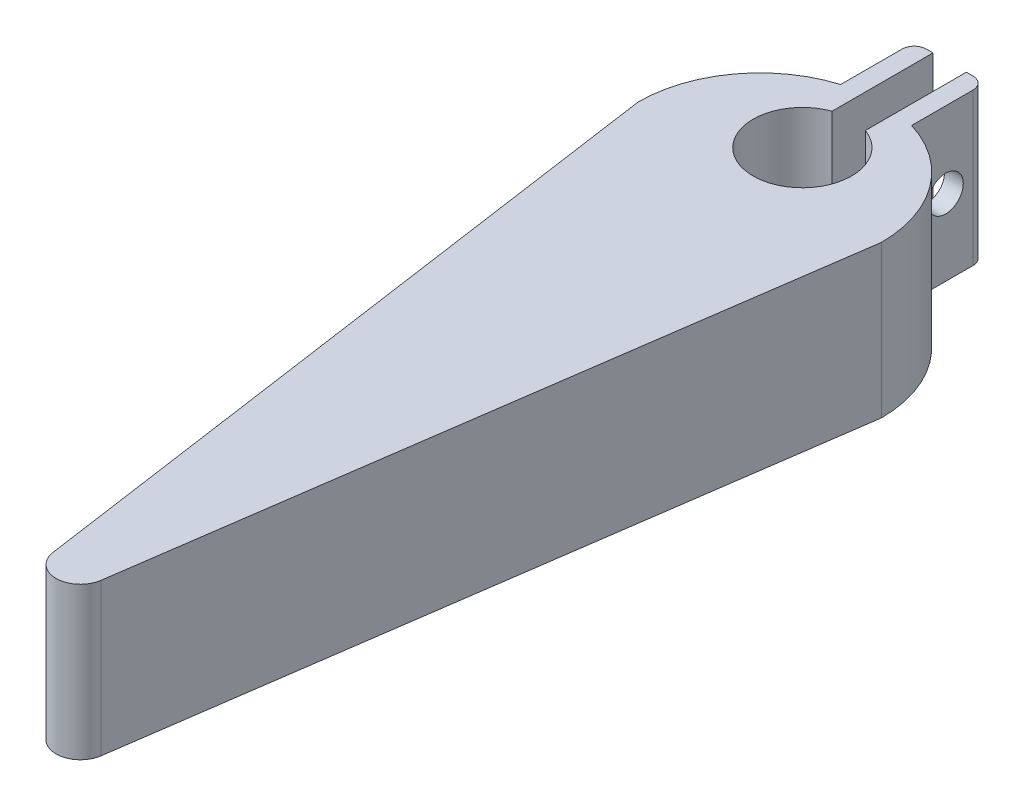
ISO-10303-21;
HEADER;
FILE_DESCRIPTION(('STEP AP214'),'2;1');
FILE_NAME('part.step','',(''),(''),'','','');
FILE_SCHEMA(('AUTOMOTIVE_DESIGN { 1 0 10303 214 1 1 1 1 }'));
ENDSEC;
DATA;
#1=APPLICATION_CONTEXT('core data for automotive mechanical design processes');
#2=APPLICATION_PROTOCOL_DEFINITION('international standard','automotive_design',2000,#1);
#3=PRODUCT_CONTEXT('',#1,'mechanical');
#4=PRODUCT('Part','Part','',(#3));
#5=PRODUCT_RELATED_PRODUCT_CATEGORY('part','',(#4));
#6=PRODUCT_DEFINITION_FORMATION('','',#4);
#7=PRODUCT_DEFINITION_CONTEXT('part definition',#1,'design');
#8=PRODUCT_DEFINITION('design','',#6,#7);
#9=PRODUCT_DEFINITION_SHAPE('','',#8);
#10=(LENGTH_UNIT() NAMED_UNIT(*) SI_UNIT(.MILLI.,.METRE.));
#11=(NAMED_UNIT(*) PLANE_ANGLE_UNIT() SI_UNIT($,.RADIAN.));
#12=(NAMED_UNIT(*) SI_UNIT($,.STERADIAN.) SOLID_ANGLE_UNIT());
#13=UNCERTAINTY_MEASURE_WITH_UNIT(LENGTH_MEASURE(1.E-05),#10,'distance_accuracy_value','');
#14=(GEOMETRIC_REPRESENTATION_CONTEXT(3) GLOBAL_UNCERTAINTY_ASSIGNED_CONTEXT((#13)) GLOBAL_UNIT_ASSIGNED_CONTEXT((#10,
#11,#12)) REPRESENTATION_CONTEXT('',''));
#15=CARTESIAN_POINT('',(0.,0.,0.));
#16=DIRECTION('',(0.,0.,1.));
#17=DIRECTION('',(1.,0.,0.));
#18=AXIS2_PLACEMENT_3D('',#15,#16,#17);
#19=CARTESIAN_POINT('',(0.,12.5,0.));
#20=DIRECTION('',(0.,-1.,0.));
#21=DIRECTION('',(0.,0.,-1.));
#22=AXIS2_PLACEMENT_3D('',#19,#20,#21);
#23=CYLINDRICAL_SURFACE('',#22,10.);
#24=CARTESIAN_POINT('',(0.,12.5,0.));
#25=DIRECTION('',(0.,1.,0.));
#26=DIRECTION('',(0.,0.,-1.));
#27=AXIS2_PLACEMENT_3D('',#24,#25,#26);
#28=CIRCLE('',#27,10.);
#29=CARTESIAN_POINT('',(-2.91788586974109,12.5,-9.56482838587109));
#30=VERTEX_POINT('',#29);
#31=CARTESIAN_POINT('',(-10.,12.5,0.));
#32=VERTEX_POINT('',#31);
#33=EDGE_CURVE('E194',#30,#32,#28,.T.);
#34=ORIENTED_EDGE('',*,*,#33,.F.);
#35=DIRECTION('',(0.,1.,0.));
#36=VECTOR('',#35,1.);
#37=CARTESIAN_POINT('',(-2.91788586974109,0.,-9.56482838587109));
#38=LINE('',#37,#36);
#39=CARTESIAN_POINT('',(-2.91788586974109,0.,-9.56482838587109));
#40=VERTEX_POINT('',#39);
#41=EDGE_CURVE('E177',#40,#30,#38,.T.);
#42=ORIENTED_EDGE('',*,*,#41,.F.);
#43=CARTESIAN_POINT('',(0.,0.,0.));
#44=DIRECTION('',(0.,1.,0.));
#45=DIRECTION('',(0.,0.,-1.));
#46=AXIS2_PLACEMENT_3D('',#43,#44,#45);
#47=CIRCLE('',#46,10.);
#48=CARTESIAN_POINT('',(-10.,0.,0.));
#49=VERTEX_POINT('',#48);
#50=EDGE_CURVE('E188',#40,#49,#47,.T.);
#51=ORIENTED_EDGE('',*,*,#50,.T.);
#52=DIRECTION('',(0.,-1.,0.));
#53=VECTOR('',#52,1.);
#54=CARTESIAN_POINT('',(-10.,12.5,0.));
#55=LINE('',#54,#53);
#56=EDGE_CURVE('E209',#32,#49,#55,.T.);
#57=ORIENTED_EDGE('',*,*,#56,.F.);
#58=EDGE_LOOP('',(#34,#42,#51,#57));
#59=FACE_BOUND('',#58,.T.);
#60=ADVANCED_FACE('F37',(#59),#23,.T.);
#61=CARTESIAN_POINT('',(0.,12.5,0.));
#62=DIRECTION('',(0.,-1.,0.));
#63=DIRECTION('',(0.,0.,-1.));
#64=AXIS2_PLACEMENT_3D('',#61,#62,#63);
#65=PLANE('',#64);
#66=DIRECTION('',(-1.,0.,0.));
#67=VECTOR('',#66,1.);
#68=CARTESIAN_POINT('',(-1.3711215575442,12.5,-15.6135914165917));
#69=LINE('',#68,#67);
#70=CARTESIAN_POINT('',(-1.3711215575442,12.5,-15.6135914165917));
#71=VERTEX_POINT('',#70);
#72=CARTESIAN_POINT('',(-1.91788586974109,12.5,-15.6135914165917));
#73=VERTEX_POINT('',#72);
#74=EDGE_CURVE('E160',#71,#73,#69,.T.);
#75=ORIENTED_EDGE('',*,*,#74,.T.);
#76=CARTESIAN_POINT('',(-1.91788586974109,12.5,-14.6135914165917));
#77=DIRECTION('',(0.,-1.,0.));
#78=DIRECTION('',(0.,0.,-1.));
#79=AXIS2_PLACEMENT_3D('',#76,#77,#78);
#80=CIRCLE('',#79,1.);
#81=CARTESIAN_POINT('',(-2.91788586974109,12.5,-14.6135914165917));
#82=VERTEX_POINT('',#81);
#83=EDGE_CURVE('E230',#73,#82,#80,.F.);
#84=ORIENTED_EDGE('',*,*,#83,.T.);
#85=DIRECTION('',(0.,0.,1.));
#86=VECTOR('',#85,1.);
#87=CARTESIAN_POINT('',(-2.91788586974109,12.5,-9.56482838587109));
#88=LINE('',#87,#86);
#89=EDGE_CURVE('E163',#82,#30,#88,.T.);
#90=ORIENTED_EDGE('',*,*,#89,.T.);
#91=ORIENTED_EDGE('',*,*,#33,.T.);
#92=DIRECTION('',(0.14142135623731,0.,0.989949493661166));
#93=VECTOR('',#92,1.);
#94=CARTESIAN_POINT('',(-10.,12.5,0.));
#95=LINE('',#94,#93);
#96=CARTESIAN_POINT('',(-1.97989898732233,12.5,56.1407070887437));
#97=VERTEX_POINT('',#96);
#98=EDGE_CURVE('E193',#32,#97,#95,.T.);
#99=ORIENTED_EDGE('',*,*,#98,.T.);
#100=CARTESIAN_POINT('',(0.,12.5,55.8578643762691));
#101=DIRECTION('',(0.,-1.,0.));
#102=DIRECTION('',(0.,0.,-1.));
#103=AXIS2_PLACEMENT_3D('',#100,#101,#102);
#104=CIRCLE('',#103,2.);
#105=CARTESIAN_POINT('',(1.97989898732234,12.5,56.1407070887437));
#106=VERTEX_POINT('',#105);
#107=EDGE_CURVE('E219',#97,#106,#104,.F.);
#108=ORIENTED_EDGE('',*,*,#107,.T.);
#109=DIRECTION('',(0.14142135623731,0.,-0.989949493661167));
#110=VECTOR('',#109,1.);
#111=CARTESIAN_POINT('',(0.,12.5,70.));
#112=LINE('',#111,#110);
#113=CARTESIAN_POINT('',(10.,12.5,0.));
#114=VERTEX_POINT('',#113);
#115=EDGE_CURVE('E197',#106,#114,#112,.T.);
#116=ORIENTED_EDGE('',*,*,#115,.T.);
#117=CARTESIAN_POINT('',(2.91707262499972,12.5,-9.56507643986588));
#118=VERTEX_POINT('',#117);
#119=EDGE_CURVE('E190',#114,#118,#28,.T.);
#120=ORIENTED_EDGE('',*,*,#119,.T.);
#121=DIRECTION('',(0.,0.,-1.));
#122=VECTOR('',#121,1.);
#123=CARTESIAN_POINT('',(2.91707262499972,12.5,-15.6135914165917));
#124=LINE('',#123,#122);
#125=CARTESIAN_POINT('',(2.91707262499972,12.5,-14.6135914165917));
#126=VERTEX_POINT('',#125);
#127=EDGE_CURVE('E243',#118,#126,#124,.T.);
#128=ORIENTED_EDGE('',*,*,#127,.T.);
#129=CARTESIAN_POINT('',(1.91707262499972,12.5,-14.6135914165917));
#130=DIRECTION('',(0.,-1.,0.));
#131=DIRECTION('',(0.,0.,-1.));
#132=AXIS2_PLACEMENT_3D('',#129,#130,#131);
#133=CIRCLE('',#132,1.);
#134=CARTESIAN_POINT('',(1.91707262499972,12.5,-15.6135914165917));
#135=VERTEX_POINT('',#134);
#136=EDGE_CURVE('E228',#126,#135,#133,.F.);
#137=ORIENTED_EDGE('',*,*,#136,.T.);
#138=DIRECTION('',(-1.,0.,0.));
#139=VECTOR('',#138,1.);
#140=CARTESIAN_POINT('',(1.37409961350026,12.5,-15.6135914165917));
#141=LINE('',#140,#139);
#142=CARTESIAN_POINT('',(1.37409961350026,12.5,-15.6135914165917));
#143=VERTEX_POINT('',#142);
#144=EDGE_CURVE('E167',#135,#143,#141,.T.);
#145=ORIENTED_EDGE('',*,*,#144,.T.);
#146=DIRECTION('',(0.,0.,-1.));
#147=VECTOR('',#146,1.);
#148=CARTESIAN_POINT('',(1.37409961350026,12.5,-3.75657427081889));
#149=LINE('',#148,#147);
#150=CARTESIAN_POINT('',(1.37409961350026,12.5,-7.30977036738154));
#151=VERTEX_POINT('',#150);
#152=EDGE_CURVE('E159',#151,#143,#149,.T.);
#153=ORIENTED_EDGE('',*,*,#152,.F.);
#154=CARTESIAN_POINT('',(0.,12.5,-3.5));
#155=DIRECTION('',(0.,1.,0.));
#156=DIRECTION('',(0.,0.,1.));
#157=AXIS2_PLACEMENT_3D('',#154,#155,#156);
#158=CIRCLE('',#157,4.05);
#159=CARTESIAN_POINT('',(-1.3711215575442,12.5,-7.31084317106301));
#160=VERTEX_POINT('',#159);
#161=EDGE_CURVE('E185',#160,#151,#158,.T.);
#162=ORIENTED_EDGE('',*,*,#161,.F.);
#163=DIRECTION('',(0.,0.,1.));
#164=VECTOR('',#163,1.);
#165=CARTESIAN_POINT('',(-1.3711215575442,12.5,-3.7576622618907));
#166=LINE('',#165,#164);
#167=EDGE_CURVE('E154',#71,#160,#166,.T.);
#168=ORIENTED_EDGE('',*,*,#167,.F.);
#169=EDGE_LOOP('',(#75,#84,#90,#91,#99,#108,#116,#120,#128,#137,#145,#153,#162,#168));
#170=FACE_BOUND('',#169,.T.);
#171=ADVANCED_FACE('F246',(#170),#65,.F.);
#172=CARTESIAN_POINT('',(0.,0.,0.));
#173=DIRECTION('',(0.,-1.,0.));
#174=DIRECTION('',(0.,0.,-1.));
#175=AXIS2_PLACEMENT_3D('',#172,#173,#174);
#176=PLANE('',#175);
#177=DIRECTION('',(0.,0.,1.));
#178=VECTOR('',#177,1.);
#179=CARTESIAN_POINT('',(-2.91788586974109,0.,-9.56482838587109));
#180=LINE('',#179,#178);
#181=CARTESIAN_POINT('',(-2.91788586974109,0.,-14.6135914165917));
#182=VERTEX_POINT('',#181);
#183=EDGE_CURVE('E173',#182,#40,#180,.T.);
#184=ORIENTED_EDGE('',*,*,#183,.F.);
#185=CARTESIAN_POINT('',(-1.91788586974109,0.,-14.6135914165917));
#186=DIRECTION('',(0.,-1.,0.));
#187=DIRECTION('',(0.,0.,-1.));
#188=AXIS2_PLACEMENT_3D('',#185,#186,#187);
#189=CIRCLE('',#188,1.);
#190=CARTESIAN_POINT('',(-1.91788586974109,0.,-15.6135914165917));
#191=VERTEX_POINT('',#190);
#192=EDGE_CURVE('E235',#182,#191,#189,.T.);
#193=ORIENTED_EDGE('',*,*,#192,.T.);
#194=DIRECTION('',(-1.,0.,0.));
#195=VECTOR('',#194,1.);
#196=CARTESIAN_POINT('',(-1.3711215575442,0.,-15.6135914165917));
#197=LINE('',#196,#195);
#198=CARTESIAN_POINT('',(-1.3711215575442,0.,-15.6135914165917));
#199=VERTEX_POINT('',#198);
#200=EDGE_CURVE('E170',#199,#191,#197,.T.);
#201=ORIENTED_EDGE('',*,*,#200,.F.);
#202=DIRECTION('',(0.,0.,1.));
#203=VECTOR('',#202,1.);
#204=CARTESIAN_POINT('',(-1.3711215575442,0.,-3.7576622618907));
#205=LINE('',#204,#203);
#206=CARTESIAN_POINT('',(-1.3711215575442,0.,-7.31084317106301));
#207=VERTEX_POINT('',#206);
#208=EDGE_CURVE('E153',#199,#207,#205,.T.);
#209=ORIENTED_EDGE('',*,*,#208,.T.);
#210=CARTESIAN_POINT('',(0.,0.,-3.5));
#211=DIRECTION('',(0.,1.,0.));
#212=DIRECTION('',(0.,0.,1.));
#213=AXIS2_PLACEMENT_3D('',#210,#211,#212);
#214=CIRCLE('',#213,4.05);
#215=CARTESIAN_POINT('',(1.37409961350026,0.,-7.30977036738154));
#216=VERTEX_POINT('',#215);
#217=EDGE_CURVE('E150',#207,#216,#214,.T.);
#218=ORIENTED_EDGE('',*,*,#217,.T.);
#219=DIRECTION('',(0.,0.,-1.));
#220=VECTOR('',#219,1.);
#221=CARTESIAN_POINT('',(1.37409961350026,0.,-3.75657427081889));
#222=LINE('',#221,#220);
#223=CARTESIAN_POINT('',(1.37409961350026,0.,-15.6135914165917));
#224=VERTEX_POINT('',#223);
#225=EDGE_CURVE('E145',#216,#224,#222,.T.);
#226=ORIENTED_EDGE('',*,*,#225,.T.);
#227=DIRECTION('',(-1.,0.,0.));
#228=VECTOR('',#227,1.);
#229=CARTESIAN_POINT('',(1.37409961350026,0.,-15.6135914165917));
#230=LINE('',#229,#228);
#231=CARTESIAN_POINT('',(1.91707262499972,0.,-15.6135914165917));
#232=VERTEX_POINT('',#231);
#233=EDGE_CURVE('E136',#232,#224,#230,.T.);
#234=ORIENTED_EDGE('',*,*,#233,.F.);
#235=CARTESIAN_POINT('',(1.91707262499972,0.,-14.6135914165917));
#236=DIRECTION('',(0.,-1.,0.));
#237=DIRECTION('',(0.,0.,-1.));
#238=AXIS2_PLACEMENT_3D('',#235,#236,#237);
#239=CIRCLE('',#238,1.);
#240=CARTESIAN_POINT('',(2.91707262499972,0.,-14.6135914165917));
#241=VERTEX_POINT('',#240);
#242=EDGE_CURVE('E52',#232,#241,#239,.T.);
#243=ORIENTED_EDGE('',*,*,#242,.T.);
#244=DIRECTION('',(0.,0.,-1.));
#245=VECTOR('',#244,1.);
#246=CARTESIAN_POINT('',(2.91707262499972,0.,-15.6135914165917));
#247=LINE('',#246,#245);
#248=CARTESIAN_POINT('',(2.91707262499972,0.,-9.56507643986588));
#249=VERTEX_POINT('',#248);
#250=EDGE_CURVE('E142',#249,#241,#247,.T.);
#251=ORIENTED_EDGE('',*,*,#250,.F.);
#252=CARTESIAN_POINT('',(10.,0.,0.));
#253=VERTEX_POINT('',#252);
#254=EDGE_CURVE('E200',#253,#249,#47,.T.);
#255=ORIENTED_EDGE('',*,*,#254,.F.);
#256=DIRECTION('',(0.14142135623731,0.,-0.989949493661167));
#257=VECTOR('',#256,1.);
#258=CARTESIAN_POINT('',(0.,0.,70.));
#259=LINE('',#258,#257);
#260=CARTESIAN_POINT('',(1.97989898732234,0.,56.1407070887437));
#261=VERTEX_POINT('',#260);
#262=EDGE_CURVE('E205',#261,#253,#259,.T.);
#263=ORIENTED_EDGE('',*,*,#262,.F.);
#264=CARTESIAN_POINT('',(0.,0.,55.8578643762691));
#265=DIRECTION('',(0.,-1.,0.));
#266=DIRECTION('',(0.,0.,-1.));
#267=AXIS2_PLACEMENT_3D('',#264,#265,#266);
#268=CIRCLE('',#267,2.);
#269=CARTESIAN_POINT('',(-1.97989898732233,0.,56.1407070887437));
#270=VERTEX_POINT('',#269);
#271=EDGE_CURVE('E215',#261,#270,#268,.T.);
#272=ORIENTED_EDGE('',*,*,#271,.T.);
#273=DIRECTION('',(0.14142135623731,0.,0.989949493661166));
#274=VECTOR('',#273,1.);
#275=CARTESIAN_POINT('',(-10.,0.,0.));
#276=LINE('',#275,#274);
#277=EDGE_CURVE('E202',#49,#270,#276,.T.);
#278=ORIENTED_EDGE('',*,*,#277,.F.);
#279=ORIENTED_EDGE('',*,*,#50,.F.);
#280=EDGE_LOOP('',(#184,#193,#201,#209,#218,#226,#234,#243,#251,#255,#263,#272,#278,#279));
#281=FACE_BOUND('',#280,.T.);
#282=ADVANCED_FACE('F147',(#281),#176,.T.);
#283=ORIENTED_EDGE('',*,*,#254,.T.);
#284=DIRECTION('',(0.,1.,0.));
#285=VECTOR('',#284,1.);
#286=CARTESIAN_POINT('',(2.91707262499972,0.,-9.56507643986588));
#287=LINE('',#286,#285);
#288=EDGE_CURVE('E141',#249,#118,#287,.T.);
#289=ORIENTED_EDGE('',*,*,#288,.T.);
#290=ORIENTED_EDGE('',*,*,#119,.F.);
#291=DIRECTION('',(0.,-1.,0.));
#292=VECTOR('',#291,1.);
#293=CARTESIAN_POINT('',(10.,12.5,0.));
#294=LINE('',#293,#292);
#295=EDGE_CURVE('E199',#114,#253,#294,.T.);
#296=ORIENTED_EDGE('',*,*,#295,.T.);
#297=EDGE_LOOP('',(#283,#289,#290,#296));
#298=FACE_BOUND('',#297,.T.);
#299=ADVANCED_FACE('F280',(#298),#23,.T.);
#300=CARTESIAN_POINT('',(-10.,12.5,0.));
#301=DIRECTION('',(0.989949493661166,0.,-0.14142135623731));
#302=DIRECTION('',(-0.14142135623731,0.,-0.989949493661167));
#303=AXIS2_PLACEMENT_3D('',#300,#301,#302);
#304=PLANE('',#303);
#305=ORIENTED_EDGE('',*,*,#277,.T.);
#306=DIRECTION('',(0.,-1.,0.));
#307=VECTOR('',#306,1.);
#308=CARTESIAN_POINT('',(-1.97989898732233,12.5,56.1407070887437));
#309=LINE('',#308,#307);
#310=EDGE_CURVE('E217',#270,#97,#309,.F.);
#311=ORIENTED_EDGE('',*,*,#310,.T.);
#312=ORIENTED_EDGE('',*,*,#98,.F.);
#313=ORIENTED_EDGE('',*,*,#56,.T.);
#314=EDGE_LOOP('',(#305,#311,#312,#313));
#315=FACE_BOUND('',#314,.T.);
#316=ADVANCED_FACE('F289',(#315),#304,.F.);
#317=CARTESIAN_POINT('',(0.,12.5,70.));
#318=DIRECTION('',(-0.989949493661166,0.,-0.14142135623731));
#319=DIRECTION('',(-0.14142135623731,0.,0.989949493661167));
#320=AXIS2_PLACEMENT_3D('',#317,#318,#319);
#321=PLANE('',#320);
#322=ORIENTED_EDGE('',*,*,#115,.F.);
#323=DIRECTION('',(0.,-1.,0.));
#324=VECTOR('',#323,1.);
#325=CARTESIAN_POINT('',(1.97989898732234,12.5,56.1407070887437));
#326=LINE('',#325,#324);
#327=EDGE_CURVE('E212',#106,#261,#326,.T.);
#328=ORIENTED_EDGE('',*,*,#327,.T.);
#329=ORIENTED_EDGE('',*,*,#262,.T.);
#330=ORIENTED_EDGE('',*,*,#295,.F.);
#331=EDGE_LOOP('',(#322,#328,#329,#330));
#332=FACE_BOUND('',#331,.T.);
#333=ADVANCED_FACE('F295',(#332),#321,.F.);
#334=CARTESIAN_POINT('',(0.,12.5,-3.5));
#335=DIRECTION('',(0.,-1.,0.));
#336=DIRECTION('',(0.,0.,-1.));
#337=AXIS2_PLACEMENT_3D('',#334,#335,#336);
#338=CYLINDRICAL_SURFACE('',#337,4.05);
#339=DIRECTION('',(0.,-1.,0.));
#340=VECTOR('',#339,1.);
#341=CARTESIAN_POINT('',(-1.3711215575442,12.5,-7.31084317106301));
#342=LINE('',#341,#340);
#343=EDGE_CURVE('E223',#160,#207,#342,.T.);
#344=ORIENTED_EDGE('',*,*,#343,.F.);
#345=ORIENTED_EDGE('',*,*,#161,.T.);
#346=DIRECTION('',(0.,-1.,0.));
#347=VECTOR('',#346,1.);
#348=CARTESIAN_POINT('',(1.37409961350026,12.5,-7.30977036738154));
#349=LINE('',#348,#347);
#350=EDGE_CURVE('E221',#216,#151,#349,.F.);
#351=ORIENTED_EDGE('',*,*,#350,.F.);
#352=ORIENTED_EDGE('',*,*,#217,.F.);
#353=EDGE_LOOP('',(#344,#345,#351,#352));
#354=FACE_BOUND('',#353,.T.);
#355=ADVANCED_FACE('F328',(#354),#338,.F.);
#356=CARTESIAN_POINT('',(0.,12.5,55.8578643762691));
#357=DIRECTION('',(0.,-1.,0.));
#358=DIRECTION('',(0.,0.,-1.));
#359=AXIS2_PLACEMENT_3D('',#356,#357,#358);
#360=CYLINDRICAL_SURFACE('',#359,2.);
#361=ORIENTED_EDGE('',*,*,#107,.F.);
#362=ORIENTED_EDGE('',*,*,#310,.F.);
#363=ORIENTED_EDGE('',*,*,#271,.F.);
#364=ORIENTED_EDGE('',*,*,#327,.F.);
#365=EDGE_LOOP('',(#361,#362,#363,#364));
#366=FACE_BOUND('',#365,.T.);
#367=ADVANCED_FACE('F307',(#366),#360,.T.);
#368=CARTESIAN_POINT('',(1.37409961350026,0.,-3.75657427081889));
#369=DIRECTION('',(1.,0.,0.));
#370=DIRECTION('',(0.,0.,-1.));
#371=AXIS2_PLACEMENT_3D('',#368,#369,#370);
#372=PLANE('',#371);
#373=CARTESIAN_POINT('',(1.37409961350026,6.25,-12.3650764398659));
#374=DIRECTION('',(1.,0.,0.));
#375=DIRECTION('',(0.,0.,-1.));
#376=AXIS2_PLACEMENT_3D('',#373,#374,#375);
#377=CIRCLE('',#376,1.45);
#378=CARTESIAN_POINT('',(1.37409961350026,6.25,-13.8150764398659));
#379=VERTEX_POINT('',#378);
#380=EDGE_CURVE('E248',#379,#379,#377,.T.);
#381=ORIENTED_EDGE('',*,*,#380,.T.);
#382=EDGE_LOOP('',(#381));
#383=FACE_BOUND('',#382,.T.);
#384=ORIENTED_EDGE('',*,*,#225,.F.);
#385=ORIENTED_EDGE('',*,*,#350,.T.);
#386=ORIENTED_EDGE('',*,*,#152,.T.);
#387=DIRECTION('',(0.,1.,0.));
#388=VECTOR('',#387,1.);
#389=CARTESIAN_POINT('',(1.37409961350026,0.,-15.6135914165917));
#390=LINE('',#389,#388);
#391=EDGE_CURVE('E140',#224,#143,#390,.T.);
#392=ORIENTED_EDGE('',*,*,#391,.F.);
#393=EDGE_LOOP('',(#384,#385,#386,#392));
#394=FACE_BOUND('',#393,.T.);
#395=ADVANCED_FACE('F157',(#383,#394),#372,.F.);
#396=CARTESIAN_POINT('',(-1.3711215575442,0.,-3.7576622618907));
#397=DIRECTION('',(-1.,0.,0.));
#398=DIRECTION('',(0.,0.,1.));
#399=AXIS2_PLACEMENT_3D('',#396,#397,#398);
#400=PLANE('',#399);
#401=CARTESIAN_POINT('',(-1.3711215575442,6.25,-12.3650764398659));
#402=DIRECTION('',(-1.,0.,0.));
#403=DIRECTION('',(0.,0.,1.));
#404=AXIS2_PLACEMENT_3D('',#401,#402,#403);
#405=CIRCLE('',#404,1.45);
#406=CARTESIAN_POINT('',(-1.3711215575442,6.25,-10.9150764398659));
#407=VERTEX_POINT('',#406);
#408=EDGE_CURVE('E250',#407,#407,#405,.T.);
#409=ORIENTED_EDGE('',*,*,#408,.T.);
#410=EDGE_LOOP('',(#409));
#411=FACE_BOUND('',#410,.T.);
#412=ORIENTED_EDGE('',*,*,#167,.T.);
#413=ORIENTED_EDGE('',*,*,#343,.T.);
#414=ORIENTED_EDGE('',*,*,#208,.F.);
#415=DIRECTION('',(0.,1.,0.));
#416=VECTOR('',#415,1.);
#417=CARTESIAN_POINT('',(-1.3711215575442,0.,-15.6135914165917));
#418=LINE('',#417,#416);
#419=EDGE_CURVE('E174',#199,#71,#418,.T.);
#420=ORIENTED_EDGE('',*,*,#419,.T.);
#421=EDGE_LOOP('',(#412,#413,#414,#420));
#422=FACE_BOUND('',#421,.T.);
#423=ADVANCED_FACE('F326',(#411,#422),#400,.F.);
#424=CARTESIAN_POINT('',(-2.91788586974109,0.,-9.56482838587109));
#425=DIRECTION('',(-1.,0.,0.));
#426=DIRECTION('',(0.,0.,1.));
#427=AXIS2_PLACEMENT_3D('',#424,#425,#426);
#428=PLANE('',#427);
#429=CARTESIAN_POINT('',(-2.91788586974109,6.25,-12.3650764398659));
#430=DIRECTION('',(-1.,0.,0.));
#431=DIRECTION('',(0.,0.,1.));
#432=AXIS2_PLACEMENT_3D('',#429,#430,#431);
#433=CIRCLE('',#432,1.45);
#434=CARTESIAN_POINT('',(-2.91788586974109,6.25,-10.9150764398659));
#435=VERTEX_POINT('',#434);
#436=EDGE_CURVE('E256',#435,#435,#433,.T.);
#437=ORIENTED_EDGE('',*,*,#436,.F.);
#438=EDGE_LOOP('',(#437));
#439=FACE_BOUND('',#438,.T.);
#440=ORIENTED_EDGE('',*,*,#89,.F.);
#441=DIRECTION('',(0.,1.,0.));
#442=VECTOR('',#441,1.);
#443=CARTESIAN_POINT('',(-2.91788586974109,0.,-14.6135914165917));
#444=LINE('',#443,#442);
#445=EDGE_CURVE('E232',#82,#182,#444,.F.);
#446=ORIENTED_EDGE('',*,*,#445,.T.);
#447=ORIENTED_EDGE('',*,*,#183,.T.);
#448=ORIENTED_EDGE('',*,*,#41,.T.);
#449=EDGE_LOOP('',(#440,#446,#447,#448));
#450=FACE_BOUND('',#449,.T.);
#451=ADVANCED_FACE('F315',(#439,#450),#428,.T.);
#452=CARTESIAN_POINT('',(-1.3711215575442,0.,-15.6135914165917));
#453=DIRECTION('',(0.,0.,-1.));
#454=DIRECTION('',(-1.,0.,0.));
#455=AXIS2_PLACEMENT_3D('',#452,#453,#454);
#456=PLANE('',#455);
#457=ORIENTED_EDGE('',*,*,#200,.T.);
#458=DIRECTION('',(0.,1.,0.));
#459=VECTOR('',#458,1.);
#460=CARTESIAN_POINT('',(-1.91788586974109,0.,-15.6135914165917));
#461=LINE('',#460,#459);
#462=EDGE_CURVE('E225',#191,#73,#461,.T.);
#463=ORIENTED_EDGE('',*,*,#462,.T.);
#464=ORIENTED_EDGE('',*,*,#74,.F.);
#465=ORIENTED_EDGE('',*,*,#419,.F.);
#466=EDGE_LOOP('',(#457,#463,#464,#465));
#467=FACE_BOUND('',#466,.T.);
#468=ADVANCED_FACE('F274',(#467),#456,.T.);
#469=CARTESIAN_POINT('',(1.37409961350026,0.,-15.6135914165917));
#470=DIRECTION('',(0.,0.,-1.));
#471=DIRECTION('',(-1.,0.,0.));
#472=AXIS2_PLACEMENT_3D('',#469,#470,#471);
#473=PLANE('',#472);
#474=ORIENTED_EDGE('',*,*,#144,.F.);
#475=DIRECTION('',(0.,1.,0.));
#476=VECTOR('',#475,1.);
#477=CARTESIAN_POINT('',(1.91707262499972,0.,-15.6135914165917));
#478=LINE('',#477,#476);
#479=EDGE_CURVE('E11',#135,#232,#478,.F.);
#480=ORIENTED_EDGE('',*,*,#479,.T.);
#481=ORIENTED_EDGE('',*,*,#233,.T.);
#482=ORIENTED_EDGE('',*,*,#391,.T.);
#483=EDGE_LOOP('',(#474,#480,#481,#482));
#484=FACE_BOUND('',#483,.T.);
#485=ADVANCED_FACE('F138',(#484),#473,.T.);
#486=CARTESIAN_POINT('',(2.91707262499972,0.,-15.6135914165917));
#487=DIRECTION('',(1.,0.,0.));
#488=DIRECTION('',(0.,0.,-1.));
#489=AXIS2_PLACEMENT_3D('',#486,#487,#488);
#490=PLANE('',#489);
#491=CARTESIAN_POINT('',(2.91707262499972,6.25,-12.3650764398659));
#492=DIRECTION('',(1.,0.,0.));
#493=DIRECTION('',(0.,0.,-1.));
#494=AXIS2_PLACEMENT_3D('',#491,#492,#493);
#495=CIRCLE('',#494,1.45);
#496=CARTESIAN_POINT('',(2.91707262499972,6.25,-13.8150764398659));
#497=VERTEX_POINT('',#496);
#498=EDGE_CURVE('E259',#497,#497,#495,.T.);
#499=ORIENTED_EDGE('',*,*,#498,.F.);
#500=EDGE_LOOP('',(#499));
#501=FACE_BOUND('',#500,.T.);
#502=ORIENTED_EDGE('',*,*,#250,.T.);
#503=DIRECTION('',(0.,1.,0.));
#504=VECTOR('',#503,1.);
#505=CARTESIAN_POINT('',(2.91707262499972,0.,-14.6135914165917));
#506=LINE('',#505,#504);
#507=EDGE_CURVE('E45',#241,#126,#506,.T.);
#508=ORIENTED_EDGE('',*,*,#507,.T.);
#509=ORIENTED_EDGE('',*,*,#127,.F.);
#510=ORIENTED_EDGE('',*,*,#288,.F.);
#511=EDGE_LOOP('',(#502,#508,#509,#510));
#512=FACE_BOUND('',#511,.T.);
#513=ADVANCED_FACE('F241',(#501,#512),#490,.T.);
#514=CARTESIAN_POINT('',(-1.91788586974109,0.,-14.6135914165917));
#515=DIRECTION('',(0.,1.,0.));
#516=DIRECTION('',(0.,0.,1.));
#517=AXIS2_PLACEMENT_3D('',#514,#515,#516);
#518=CYLINDRICAL_SURFACE('',#517,1.);
#519=ORIENTED_EDGE('',*,*,#192,.F.);
#520=ORIENTED_EDGE('',*,*,#445,.F.);
#521=ORIENTED_EDGE('',*,*,#83,.F.);
#522=ORIENTED_EDGE('',*,*,#462,.F.);
#523=EDGE_LOOP('',(#519,#520,#521,#522));
#524=FACE_BOUND('',#523,.T.);
#525=ADVANCED_FACE('F267',(#524),#518,.T.);
#526=CARTESIAN_POINT('',(1.91707262499972,0.,-14.6135914165917));
#527=DIRECTION('',(0.,1.,0.));
#528=DIRECTION('',(0.,0.,1.));
#529=AXIS2_PLACEMENT_3D('',#526,#527,#528);
#530=CYLINDRICAL_SURFACE('',#529,1.);
#531=ORIENTED_EDGE('',*,*,#242,.F.);
#532=ORIENTED_EDGE('',*,*,#479,.F.);
#533=ORIENTED_EDGE('',*,*,#136,.F.);
#534=ORIENTED_EDGE('',*,*,#507,.F.);
#535=EDGE_LOOP('',(#531,#532,#533,#534));
#536=FACE_BOUND('',#535,.T.);
#537=ADVANCED_FACE('F39',(#536),#530,.T.);
#538=CARTESIAN_POINT('',(-10.,6.25,-12.3650764398659));
#539=DIRECTION('',(1.,0.,0.));
#540=DIRECTION('',(0.,0.,-1.));
#541=AXIS2_PLACEMENT_3D('',#538,#539,#540);
#542=CYLINDRICAL_SURFACE('',#541,1.45);
#543=ORIENTED_EDGE('',*,*,#498,.T.);
#544=EDGE_LOOP('',(#543));
#545=FACE_BOUND('',#544,.T.);
#546=ORIENTED_EDGE('',*,*,#380,.F.);
#547=EDGE_LOOP('',(#546));
#548=FACE_BOUND('',#547,.T.);
#549=ADVANCED_FACE('F263',(#545,#548),#542,.F.);
#550=ORIENTED_EDGE('',*,*,#436,.T.);
#551=EDGE_LOOP('',(#550));
#552=FACE_BOUND('',#551,.T.);
#553=ORIENTED_EDGE('',*,*,#408,.F.);
#554=EDGE_LOOP('',(#553));
#555=FACE_BOUND('',#554,.T.);
#556=ADVANCED_FACE('F333',(#552,#555),#542,.F.);
#557=CLOSED_SHELL('',(#60,#171,#282,#299,#316,#333,#355,#367,#395,#423,#451,#468,#485,#513,#525,
#537,#549,#556));
#558=MANIFOLD_SOLID_BREP('B2',#557);
#559=ADVANCED_BREP_SHAPE_REPRESENTATION('',(#18,#558),#14);
#560=SHAPE_DEFINITION_REPRESENTATION(#9,#559);
ENDSEC;
END-ISO-10303-21;
